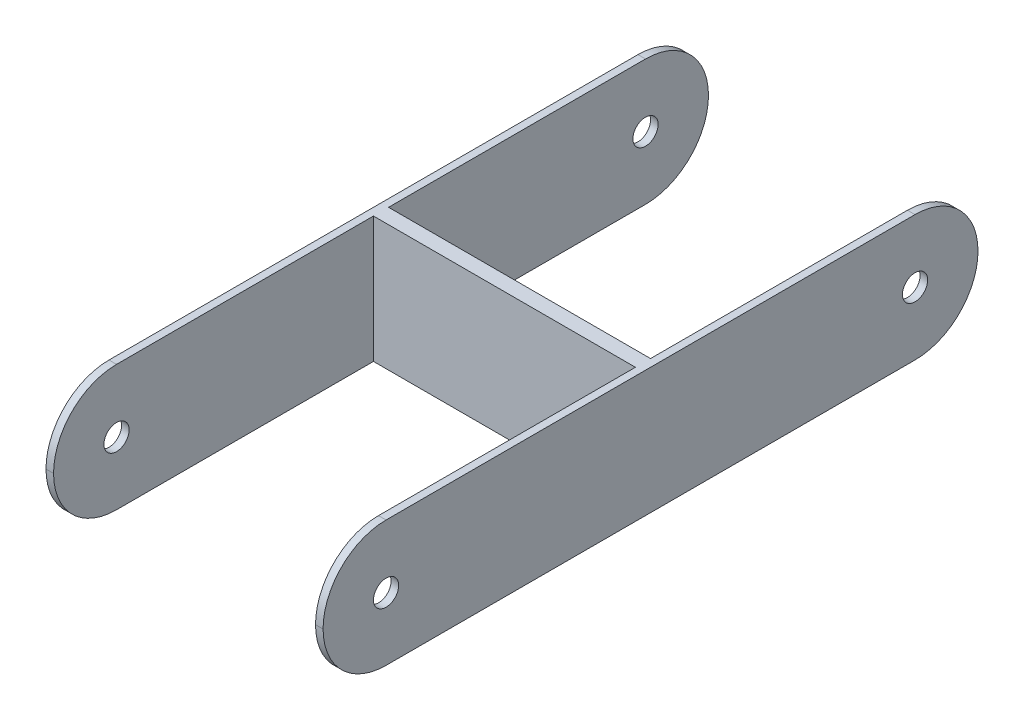
ISO-10303-21;
HEADER;
FILE_DESCRIPTION(('STEP AP214'),'2;1');
FILE_NAME('part.step','',(''),(''),'','','');
FILE_SCHEMA(('AUTOMOTIVE_DESIGN { 1 0 10303 214 1 1 1 1 }'));
ENDSEC;
DATA;
#1=APPLICATION_CONTEXT('core data for automotive mechanical design processes');
#2=APPLICATION_PROTOCOL_DEFINITION('international standard','automotive_design',2000,#1);
#3=PRODUCT_CONTEXT('',#1,'mechanical');
#4=PRODUCT('Part','Part','',(#3));
#5=PRODUCT_RELATED_PRODUCT_CATEGORY('part','',(#4));
#6=PRODUCT_DEFINITION_FORMATION('','',#4);
#7=PRODUCT_DEFINITION_CONTEXT('part definition',#1,'design');
#8=PRODUCT_DEFINITION('design','',#6,#7);
#9=PRODUCT_DEFINITION_SHAPE('','',#8);
#10=(LENGTH_UNIT() NAMED_UNIT(*) SI_UNIT(.MILLI.,.METRE.));
#11=(NAMED_UNIT(*) PLANE_ANGLE_UNIT() SI_UNIT($,.RADIAN.));
#12=(NAMED_UNIT(*) SI_UNIT($,.STERADIAN.) SOLID_ANGLE_UNIT());
#13=UNCERTAINTY_MEASURE_WITH_UNIT(LENGTH_MEASURE(1.E-05),#10,'distance_accuracy_value','');
#14=(GEOMETRIC_REPRESENTATION_CONTEXT(3) GLOBAL_UNCERTAINTY_ASSIGNED_CONTEXT((#13)) GLOBAL_UNIT_ASSIGNED_CONTEXT((#10,
#11,#12)) REPRESENTATION_CONTEXT('',''));
#15=CARTESIAN_POINT('',(0.,0.,0.));
#16=DIRECTION('',(0.,0.,1.));
#17=DIRECTION('',(1.,0.,0.));
#18=AXIS2_PLACEMENT_3D('',#15,#16,#17);
#19=CARTESIAN_POINT('',(-27.5,12.5,32.5));
#20=DIRECTION('',(1.,0.,0.));
#21=DIRECTION('',(0.,0.,-1.));
#22=AXIS2_PLACEMENT_3D('',#19,#20,#21);
#23=PLANE('',#22);
#24=CARTESIAN_POINT('',(-27.5,0.,85.));
#25=DIRECTION('',(-1.,0.,0.));
#26=DIRECTION('',(0.,0.,1.));
#27=AXIS2_PLACEMENT_3D('',#24,#25,#26);
#28=CIRCLE('',#27,2.5);
#29=CARTESIAN_POINT('',(-27.5,0.,87.5));
#30=VERTEX_POINT('',#29);
#31=EDGE_CURVE('E289',#30,#30,#28,.T.);
#32=ORIENTED_EDGE('',*,*,#31,.F.);
#33=EDGE_LOOP('',(#32));
#34=FACE_BOUND('',#33,.T.);
#35=CARTESIAN_POINT('',(-27.5,0.,-20.));
#36=DIRECTION('',(1.,0.,0.));
#37=DIRECTION('',(0.,0.,-1.));
#38=AXIS2_PLACEMENT_3D('',#35,#36,#37);
#39=CIRCLE('',#38,2.5);
#40=CARTESIAN_POINT('',(-27.5,0.,-22.5));
#41=VERTEX_POINT('',#40);
#42=EDGE_CURVE('E187',#41,#41,#39,.T.);
#43=ORIENTED_EDGE('',*,*,#42,.T.);
#44=EDGE_LOOP('',(#43));
#45=FACE_BOUND('',#44,.T.);
#46=DIRECTION('',(0.,0.,1.));
#47=VECTOR('',#46,1.);
#48=CARTESIAN_POINT('',(-27.5,-12.5,32.5));
#49=LINE('',#48,#47);
#50=CARTESIAN_POINT('',(-27.5,-12.5,-20.));
#51=VERTEX_POINT('',#50);
#52=CARTESIAN_POINT('',(-27.5,-12.5,85.));
#53=VERTEX_POINT('',#52);
#54=EDGE_CURVE('E208',#51,#53,#49,.T.);
#55=ORIENTED_EDGE('',*,*,#54,.T.);
#56=CARTESIAN_POINT('',(-27.5,0.,85.));
#57=DIRECTION('',(1.,0.,0.));
#58=DIRECTION('',(0.,0.,-1.));
#59=AXIS2_PLACEMENT_3D('',#56,#57,#58);
#60=CIRCLE('',#59,12.5);
#61=CARTESIAN_POINT('',(-27.5,0.,97.5));
#62=VERTEX_POINT('',#61);
#63=EDGE_CURVE('E266',#53,#62,#60,.F.);
#64=ORIENTED_EDGE('',*,*,#63,.T.);
#65=CARTESIAN_POINT('',(-27.5,0.,85.));
#66=DIRECTION('',(1.,0.,0.));
#67=DIRECTION('',(0.,0.,-1.));
#68=AXIS2_PLACEMENT_3D('',#65,#66,#67);
#69=CIRCLE('',#68,12.5);
#70=CARTESIAN_POINT('',(-27.5,12.5,85.));
#71=VERTEX_POINT('',#70);
#72=EDGE_CURVE('E264',#62,#71,#69,.F.);
#73=ORIENTED_EDGE('',*,*,#72,.T.);
#74=DIRECTION('',(0.,0.,1.));
#75=VECTOR('',#74,1.);
#76=CARTESIAN_POINT('',(-27.5,12.5,32.5));
#77=LINE('',#76,#75);
#78=CARTESIAN_POINT('',(-27.5,12.5,-20.));
#79=VERTEX_POINT('',#78);
#80=EDGE_CURVE('E195',#79,#71,#77,.T.);
#81=ORIENTED_EDGE('',*,*,#80,.F.);
#82=CARTESIAN_POINT('',(-27.5,0.,-20.));
#83=DIRECTION('',(1.,0.,0.));
#84=DIRECTION('',(0.,0.,-1.));
#85=AXIS2_PLACEMENT_3D('',#82,#83,#84);
#86=CIRCLE('',#85,12.5);
#87=CARTESIAN_POINT('',(-27.5,0.,-32.5));
#88=VERTEX_POINT('',#87);
#89=EDGE_CURVE('E225',#79,#88,#86,.F.);
#90=ORIENTED_EDGE('',*,*,#89,.T.);
#91=CARTESIAN_POINT('',(-27.5,0.,-20.));
#92=DIRECTION('',(1.,0.,0.));
#93=DIRECTION('',(0.,0.,-1.));
#94=AXIS2_PLACEMENT_3D('',#91,#92,#93);
#95=CIRCLE('',#94,12.5);
#96=EDGE_CURVE('E227',#88,#51,#95,.F.);
#97=ORIENTED_EDGE('',*,*,#96,.T.);
#98=EDGE_LOOP('',(#55,#64,#73,#81,#90,#97));
#99=FACE_BOUND('',#98,.T.);
#100=ADVANCED_FACE('F33',(#34,#45,#99),#23,.F.);
#101=CARTESIAN_POINT('',(27.5,12.5,32.5));
#102=DIRECTION('',(-1.,0.,0.));
#103=DIRECTION('',(0.,0.,1.));
#104=AXIS2_PLACEMENT_3D('',#101,#102,#103);
#105=PLANE('',#104);
#106=CARTESIAN_POINT('',(27.5,0.,85.));
#107=DIRECTION('',(-1.,0.,0.));
#108=DIRECTION('',(0.,0.,1.));
#109=AXIS2_PLACEMENT_3D('',#106,#107,#108);
#110=CIRCLE('',#109,2.5);
#111=CARTESIAN_POINT('',(27.5,0.,87.5));
#112=VERTEX_POINT('',#111);
#113=EDGE_CURVE('E293',#112,#112,#110,.T.);
#114=ORIENTED_EDGE('',*,*,#113,.T.);
#115=EDGE_LOOP('',(#114));
#116=FACE_BOUND('',#115,.T.);
#117=CARTESIAN_POINT('',(27.5,0.,-20.));
#118=DIRECTION('',(1.,0.,0.));
#119=DIRECTION('',(0.,0.,-1.));
#120=AXIS2_PLACEMENT_3D('',#117,#118,#119);
#121=CIRCLE('',#120,2.5);
#122=CARTESIAN_POINT('',(27.5,0.,-22.5));
#123=VERTEX_POINT('',#122);
#124=EDGE_CURVE('E158',#123,#123,#121,.T.);
#125=ORIENTED_EDGE('',*,*,#124,.F.);
#126=EDGE_LOOP('',(#125));
#127=FACE_BOUND('',#126,.T.);
#128=CARTESIAN_POINT('',(27.5,0.,85.));
#129=DIRECTION('',(-1.,0.,0.));
#130=DIRECTION('',(0.,0.,1.));
#131=AXIS2_PLACEMENT_3D('',#128,#129,#130);
#132=CIRCLE('',#131,12.5);
#133=CARTESIAN_POINT('',(27.5,12.5,85.));
#134=VERTEX_POINT('',#133);
#135=CARTESIAN_POINT('',(27.5,0.,97.5));
#136=VERTEX_POINT('',#135);
#137=EDGE_CURVE('E42',#134,#136,#132,.F.);
#138=ORIENTED_EDGE('',*,*,#137,.T.);
#139=CARTESIAN_POINT('',(27.5,0.,85.));
#140=DIRECTION('',(-1.,0.,0.));
#141=DIRECTION('',(0.,0.,1.));
#142=AXIS2_PLACEMENT_3D('',#139,#140,#141);
#143=CIRCLE('',#142,12.5);
#144=CARTESIAN_POINT('',(27.5,-12.5,85.));
#145=VERTEX_POINT('',#144);
#146=EDGE_CURVE('E11',#136,#145,#143,.F.);
#147=ORIENTED_EDGE('',*,*,#146,.T.);
#148=DIRECTION('',(0.,0.,-1.));
#149=VECTOR('',#148,1.);
#150=CARTESIAN_POINT('',(27.5,-12.5,32.5));
#151=LINE('',#150,#149);
#152=CARTESIAN_POINT('',(27.5,-12.5,-20.));
#153=VERTEX_POINT('',#152);
#154=EDGE_CURVE('E211',#145,#153,#151,.T.);
#155=ORIENTED_EDGE('',*,*,#154,.T.);
#156=CARTESIAN_POINT('',(27.5,0.,-20.));
#157=DIRECTION('',(-1.,0.,0.));
#158=DIRECTION('',(0.,0.,1.));
#159=AXIS2_PLACEMENT_3D('',#156,#157,#158);
#160=CIRCLE('',#159,12.5);
#161=CARTESIAN_POINT('',(27.5,0.,-32.5));
#162=VERTEX_POINT('',#161);
#163=EDGE_CURVE('E250',#153,#162,#160,.F.);
#164=ORIENTED_EDGE('',*,*,#163,.T.);
#165=CARTESIAN_POINT('',(27.5,0.,-20.));
#166=DIRECTION('',(-1.,0.,0.));
#167=DIRECTION('',(0.,0.,1.));
#168=AXIS2_PLACEMENT_3D('',#165,#166,#167);
#169=CIRCLE('',#168,12.5);
#170=CARTESIAN_POINT('',(27.5,12.5,-20.));
#171=VERTEX_POINT('',#170);
#172=EDGE_CURVE('E247',#162,#171,#169,.F.);
#173=ORIENTED_EDGE('',*,*,#172,.T.);
#174=DIRECTION('',(0.,0.,-1.));
#175=VECTOR('',#174,1.);
#176=CARTESIAN_POINT('',(27.5,12.5,32.5));
#177=LINE('',#176,#175);
#178=EDGE_CURVE('E197',#134,#171,#177,.T.);
#179=ORIENTED_EDGE('',*,*,#178,.F.);
#180=EDGE_LOOP('',(#138,#147,#155,#164,#173,#179));
#181=FACE_BOUND('',#180,.T.);
#182=ADVANCED_FACE('F297',(#116,#127,#181),#105,.F.);
#183=CARTESIAN_POINT('',(26.,12.5,31.));
#184=DIRECTION('',(1.,0.,0.));
#185=DIRECTION('',(0.,0.,-1.));
#186=AXIS2_PLACEMENT_3D('',#183,#184,#185);
#187=PLANE('',#186);
#188=CARTESIAN_POINT('',(26.,0.,-20.));
#189=DIRECTION('',(1.,0.,0.));
#190=DIRECTION('',(0.,0.,-1.));
#191=AXIS2_PLACEMENT_3D('',#188,#189,#190);
#192=CIRCLE('',#191,2.5);
#193=CARTESIAN_POINT('',(26.,0.,-22.5));
#194=VERTEX_POINT('',#193);
#195=EDGE_CURVE('E191',#194,#194,#192,.T.);
#196=ORIENTED_EDGE('',*,*,#195,.T.);
#197=EDGE_LOOP('',(#196));
#198=FACE_BOUND('',#197,.T.);
#199=CARTESIAN_POINT('',(26.,0.,-20.));
#200=DIRECTION('',(1.,0.,0.));
#201=DIRECTION('',(0.,0.,-1.));
#202=AXIS2_PLACEMENT_3D('',#199,#200,#201);
#203=CIRCLE('',#202,12.5);
#204=CARTESIAN_POINT('',(26.,12.5,-20.));
#205=VERTEX_POINT('',#204);
#206=CARTESIAN_POINT('',(26.,0.,-32.5));
#207=VERTEX_POINT('',#206);
#208=EDGE_CURVE('E243',#205,#207,#203,.F.);
#209=ORIENTED_EDGE('',*,*,#208,.T.);
#210=CARTESIAN_POINT('',(26.,0.,-20.));
#211=DIRECTION('',(1.,0.,0.));
#212=DIRECTION('',(0.,0.,-1.));
#213=AXIS2_PLACEMENT_3D('',#210,#211,#212);
#214=CIRCLE('',#213,12.5);
#215=CARTESIAN_POINT('',(26.,-12.5,-20.));
#216=VERTEX_POINT('',#215);
#217=EDGE_CURVE('E245',#207,#216,#214,.F.);
#218=ORIENTED_EDGE('',*,*,#217,.T.);
#219=DIRECTION('',(0.,0.,1.));
#220=VECTOR('',#219,1.);
#221=CARTESIAN_POINT('',(26.,-12.5,31.));
#222=LINE('',#221,#220);
#223=CARTESIAN_POINT('',(26.,-12.5,31.));
#224=VERTEX_POINT('',#223);
#225=EDGE_CURVE('E214',#216,#224,#222,.T.);
#226=ORIENTED_EDGE('',*,*,#225,.T.);
#227=DIRECTION('',(0.,-1.,0.));
#228=VECTOR('',#227,1.);
#229=CARTESIAN_POINT('',(26.,12.5,31.));
#230=LINE('',#229,#228);
#231=CARTESIAN_POINT('',(26.,12.5,31.));
#232=VERTEX_POINT('',#231);
#233=EDGE_CURVE('E222',#232,#224,#230,.T.);
#234=ORIENTED_EDGE('',*,*,#233,.F.);
#235=DIRECTION('',(0.,0.,1.));
#236=VECTOR('',#235,1.);
#237=CARTESIAN_POINT('',(26.,12.5,31.));
#238=LINE('',#237,#236);
#239=EDGE_CURVE('E200',#205,#232,#238,.T.);
#240=ORIENTED_EDGE('',*,*,#239,.F.);
#241=EDGE_LOOP('',(#209,#218,#226,#234,#240));
#242=FACE_BOUND('',#241,.T.);
#243=ADVANCED_FACE('F320',(#198,#242),#187,.F.);
#244=CARTESIAN_POINT('',(26.,12.5,31.));
#245=DIRECTION('',(0.,0.,1.));
#246=DIRECTION('',(1.,0.,0.));
#247=AXIS2_PLACEMENT_3D('',#244,#245,#246);
#248=PLANE('',#247);
#249=DIRECTION('',(-1.,0.,0.));
#250=VECTOR('',#249,1.);
#251=CARTESIAN_POINT('',(26.,-12.5,31.));
#252=LINE('',#251,#250);
#253=CARTESIAN_POINT('',(-26.,-12.5,31.));
#254=VERTEX_POINT('',#253);
#255=EDGE_CURVE('E216',#224,#254,#252,.T.);
#256=ORIENTED_EDGE('',*,*,#255,.T.);
#257=DIRECTION('',(0.,-1.,0.));
#258=VECTOR('',#257,1.);
#259=CARTESIAN_POINT('',(-26.,12.5,31.));
#260=LINE('',#259,#258);
#261=CARTESIAN_POINT('',(-26.,12.5,31.));
#262=VERTEX_POINT('',#261);
#263=EDGE_CURVE('E207',#262,#254,#260,.T.);
#264=ORIENTED_EDGE('',*,*,#263,.F.);
#265=DIRECTION('',(-1.,0.,0.));
#266=VECTOR('',#265,1.);
#267=CARTESIAN_POINT('',(26.,12.5,31.));
#268=LINE('',#267,#266);
#269=EDGE_CURVE('E202',#232,#262,#268,.T.);
#270=ORIENTED_EDGE('',*,*,#269,.F.);
#271=ORIENTED_EDGE('',*,*,#233,.T.);
#272=EDGE_LOOP('',(#256,#264,#270,#271));
#273=FACE_BOUND('',#272,.T.);
#274=ADVANCED_FACE('F381',(#273),#248,.F.);
#275=CARTESIAN_POINT('',(-26.,12.5,31.));
#276=DIRECTION('',(-1.,0.,0.));
#277=DIRECTION('',(0.,0.,1.));
#278=AXIS2_PLACEMENT_3D('',#275,#276,#277);
#279=PLANE('',#278);
#280=CARTESIAN_POINT('',(-26.,0.,-20.));
#281=DIRECTION('',(-1.,0.,0.));
#282=DIRECTION('',(0.,0.,1.));
#283=AXIS2_PLACEMENT_3D('',#280,#281,#282);
#284=CIRCLE('',#283,2.5);
#285=CARTESIAN_POINT('',(-26.,0.,-17.5));
#286=VERTEX_POINT('',#285);
#287=EDGE_CURVE('E190',#286,#286,#284,.T.);
#288=ORIENTED_EDGE('',*,*,#287,.T.);
#289=EDGE_LOOP('',(#288));
#290=FACE_BOUND('',#289,.T.);
#291=DIRECTION('',(0.,0.,-1.));
#292=VECTOR('',#291,1.);
#293=CARTESIAN_POINT('',(-26.,-12.5,31.));
#294=LINE('',#293,#292);
#295=CARTESIAN_POINT('',(-26.,-12.5,-20.));
#296=VERTEX_POINT('',#295);
#297=EDGE_CURVE('E198',#254,#296,#294,.T.);
#298=ORIENTED_EDGE('',*,*,#297,.T.);
#299=CARTESIAN_POINT('',(-26.,0.,-20.));
#300=DIRECTION('',(-1.,0.,0.));
#301=DIRECTION('',(0.,0.,1.));
#302=AXIS2_PLACEMENT_3D('',#299,#300,#301);
#303=CIRCLE('',#302,12.5);
#304=CARTESIAN_POINT('',(-26.,0.,-32.5));
#305=VERTEX_POINT('',#304);
#306=EDGE_CURVE('E237',#296,#305,#303,.F.);
#307=ORIENTED_EDGE('',*,*,#306,.T.);
#308=CARTESIAN_POINT('',(-26.,0.,-20.));
#309=DIRECTION('',(-1.,0.,0.));
#310=DIRECTION('',(0.,0.,1.));
#311=AXIS2_PLACEMENT_3D('',#308,#309,#310);
#312=CIRCLE('',#311,12.5);
#313=CARTESIAN_POINT('',(-26.,12.5,-20.));
#314=VERTEX_POINT('',#313);
#315=EDGE_CURVE('E235',#305,#314,#312,.F.);
#316=ORIENTED_EDGE('',*,*,#315,.T.);
#317=DIRECTION('',(0.,0.,-1.));
#318=VECTOR('',#317,1.);
#319=CARTESIAN_POINT('',(-26.,12.5,31.));
#320=LINE('',#319,#318);
#321=EDGE_CURVE('E204',#262,#314,#320,.T.);
#322=ORIENTED_EDGE('',*,*,#321,.F.);
#323=ORIENTED_EDGE('',*,*,#263,.T.);
#324=EDGE_LOOP('',(#298,#307,#316,#322,#323));
#325=FACE_BOUND('',#324,.T.);
#326=ADVANCED_FACE('F393',(#290,#325),#279,.F.);
#327=CARTESIAN_POINT('',(0.,12.5,0.));
#328=DIRECTION('',(0.,1.,0.));
#329=DIRECTION('',(0.,0.,1.));
#330=AXIS2_PLACEMENT_3D('',#327,#328,#329);
#331=PLANE('',#330);
#332=ORIENTED_EDGE('',*,*,#80,.T.);
#333=DIRECTION('',(-1.,0.,0.));
#334=VECTOR('',#333,1.);
#335=CARTESIAN_POINT('',(0.,12.5,85.));
#336=LINE('',#335,#334);
#337=CARTESIAN_POINT('',(-26.,12.5,85.));
#338=VERTEX_POINT('',#337);
#339=EDGE_CURVE('E168',#71,#338,#336,.F.);
#340=ORIENTED_EDGE('',*,*,#339,.T.);
#341=DIRECTION('',(0.,0.,1.));
#342=VECTOR('',#341,1.);
#343=CARTESIAN_POINT('',(-26.,12.5,34.));
#344=LINE('',#343,#342);
#345=CARTESIAN_POINT('',(-26.,12.5,34.));
#346=VERTEX_POINT('',#345);
#347=EDGE_CURVE('E150',#346,#338,#344,.T.);
#348=ORIENTED_EDGE('',*,*,#347,.F.);
#349=DIRECTION('',(-1.,0.,0.));
#350=VECTOR('',#349,1.);
#351=CARTESIAN_POINT('',(26.,12.5,34.));
#352=LINE('',#351,#350);
#353=CARTESIAN_POINT('',(26.,12.5,34.));
#354=VERTEX_POINT('',#353);
#355=EDGE_CURVE('E166',#354,#346,#352,.T.);
#356=ORIENTED_EDGE('',*,*,#355,.F.);
#357=DIRECTION('',(0.,0.,-1.));
#358=VECTOR('',#357,1.);
#359=CARTESIAN_POINT('',(26.,12.5,34.));
#360=LINE('',#359,#358);
#361=CARTESIAN_POINT('',(26.,12.5,85.));
#362=VERTEX_POINT('',#361);
#363=EDGE_CURVE('E174',#362,#354,#360,.T.);
#364=ORIENTED_EDGE('',*,*,#363,.F.);
#365=DIRECTION('',(-1.,0.,0.));
#366=VECTOR('',#365,1.);
#367=CARTESIAN_POINT('',(0.,12.5,85.));
#368=LINE('',#367,#366);
#369=EDGE_CURVE('E272',#362,#134,#368,.F.);
#370=ORIENTED_EDGE('',*,*,#369,.T.);
#371=ORIENTED_EDGE('',*,*,#178,.T.);
#372=DIRECTION('',(-1.,0.,0.));
#373=VECTOR('',#372,1.);
#374=CARTESIAN_POINT('',(26.,12.5,-20.));
#375=LINE('',#374,#373);
#376=EDGE_CURVE('E239',#171,#205,#375,.T.);
#377=ORIENTED_EDGE('',*,*,#376,.T.);
#378=ORIENTED_EDGE('',*,*,#239,.T.);
#379=ORIENTED_EDGE('',*,*,#269,.T.);
#380=ORIENTED_EDGE('',*,*,#321,.T.);
#381=DIRECTION('',(-1.,0.,0.));
#382=VECTOR('',#381,1.);
#383=CARTESIAN_POINT('',(-27.5,12.5,-20.));
#384=LINE('',#383,#382);
#385=EDGE_CURVE('E241',#314,#79,#384,.T.);
#386=ORIENTED_EDGE('',*,*,#385,.T.);
#387=EDGE_LOOP('',(#332,#340,#348,#356,#364,#370,#371,#377,#378,#379,#380,#386));
#388=FACE_BOUND('',#387,.T.);
#389=ADVANCED_FACE('F164',(#388),#331,.T.);
#390=CARTESIAN_POINT('',(0.,-12.5,0.));
#391=DIRECTION('',(0.,1.,0.));
#392=DIRECTION('',(0.,0.,1.));
#393=AXIS2_PLACEMENT_3D('',#390,#391,#392);
#394=PLANE('',#393);
#395=DIRECTION('',(0.,0.,1.));
#396=VECTOR('',#395,1.);
#397=CARTESIAN_POINT('',(-26.,-12.5,34.));
#398=LINE('',#397,#396);
#399=CARTESIAN_POINT('',(-26.,-12.5,34.));
#400=VERTEX_POINT('',#399);
#401=CARTESIAN_POINT('',(-26.,-12.5,85.));
#402=VERTEX_POINT('',#401);
#403=EDGE_CURVE('E153',#400,#402,#398,.T.);
#404=ORIENTED_EDGE('',*,*,#403,.T.);
#405=DIRECTION('',(-1.,0.,0.));
#406=VECTOR('',#405,1.);
#407=CARTESIAN_POINT('',(-27.5,-12.5,85.));
#408=LINE('',#407,#406);
#409=EDGE_CURVE('E261',#402,#53,#408,.T.);
#410=ORIENTED_EDGE('',*,*,#409,.T.);
#411=ORIENTED_EDGE('',*,*,#54,.F.);
#412=DIRECTION('',(-1.,0.,0.));
#413=VECTOR('',#412,1.);
#414=CARTESIAN_POINT('',(0.,-12.5,-20.));
#415=LINE('',#414,#413);
#416=EDGE_CURVE('E232',#51,#296,#415,.F.);
#417=ORIENTED_EDGE('',*,*,#416,.T.);
#418=ORIENTED_EDGE('',*,*,#297,.F.);
#419=ORIENTED_EDGE('',*,*,#255,.F.);
#420=ORIENTED_EDGE('',*,*,#225,.F.);
#421=DIRECTION('',(-1.,0.,0.));
#422=VECTOR('',#421,1.);
#423=CARTESIAN_POINT('',(0.,-12.5,-20.));
#424=LINE('',#423,#422);
#425=EDGE_CURVE('E229',#216,#153,#424,.F.);
#426=ORIENTED_EDGE('',*,*,#425,.T.);
#427=ORIENTED_EDGE('',*,*,#154,.F.);
#428=DIRECTION('',(-1.,0.,0.));
#429=VECTOR('',#428,1.);
#430=CARTESIAN_POINT('',(26.,-12.5,85.));
#431=LINE('',#430,#429);
#432=CARTESIAN_POINT('',(26.,-12.5,85.));
#433=VERTEX_POINT('',#432);
#434=EDGE_CURVE('E252',#145,#433,#431,.T.);
#435=ORIENTED_EDGE('',*,*,#434,.T.);
#436=DIRECTION('',(0.,0.,-1.));
#437=VECTOR('',#436,1.);
#438=CARTESIAN_POINT('',(26.,-12.5,34.));
#439=LINE('',#438,#437);
#440=CARTESIAN_POINT('',(26.,-12.5,34.));
#441=VERTEX_POINT('',#440);
#442=EDGE_CURVE('E169',#433,#441,#439,.T.);
#443=ORIENTED_EDGE('',*,*,#442,.T.);
#444=DIRECTION('',(-1.,0.,0.));
#445=VECTOR('',#444,1.);
#446=CARTESIAN_POINT('',(26.,-12.5,34.));
#447=LINE('',#446,#445);
#448=EDGE_CURVE('E180',#441,#400,#447,.T.);
#449=ORIENTED_EDGE('',*,*,#448,.T.);
#450=EDGE_LOOP('',(#404,#410,#411,#417,#418,#419,#420,#426,#427,#435,#443,#449));
#451=FACE_BOUND('',#450,.T.);
#452=ADVANCED_FACE('F334',(#451),#394,.F.);
#453=CARTESIAN_POINT('',(0.,0.,-20.));
#454=DIRECTION('',(1.,0.,0.));
#455=DIRECTION('',(0.,0.,-1.));
#456=AXIS2_PLACEMENT_3D('',#453,#454,#455);
#457=CYLINDRICAL_SURFACE('',#456,12.5);
#458=ORIENTED_EDGE('',*,*,#385,.F.);
#459=ORIENTED_EDGE('',*,*,#315,.F.);
#460=DIRECTION('',(-1.,0.,0.));
#461=VECTOR('',#460,1.);
#462=CARTESIAN_POINT('',(-26.,0.,-32.5));
#463=LINE('',#462,#461);
#464=EDGE_CURVE('E212',#88,#305,#463,.F.);
#465=ORIENTED_EDGE('',*,*,#464,.F.);
#466=ORIENTED_EDGE('',*,*,#89,.F.);
#467=EDGE_LOOP('',(#458,#459,#465,#466));
#468=FACE_BOUND('',#467,.T.);
#469=ADVANCED_FACE('F330',(#468),#457,.T.);
#470=CARTESIAN_POINT('',(-27.5,0.,-20.));
#471=DIRECTION('',(-1.,0.,0.));
#472=DIRECTION('',(0.,0.,1.));
#473=AXIS2_PLACEMENT_3D('',#470,#471,#472);
#474=CYLINDRICAL_SURFACE('',#473,12.5);
#475=ORIENTED_EDGE('',*,*,#306,.F.);
#476=ORIENTED_EDGE('',*,*,#416,.F.);
#477=ORIENTED_EDGE('',*,*,#96,.F.);
#478=ORIENTED_EDGE('',*,*,#464,.T.);
#479=EDGE_LOOP('',(#475,#476,#477,#478));
#480=FACE_BOUND('',#479,.T.);
#481=ADVANCED_FACE('F326',(#480),#474,.T.);
#482=CARTESIAN_POINT('',(0.,0.,-20.));
#483=DIRECTION('',(1.,0.,0.));
#484=DIRECTION('',(0.,0.,-1.));
#485=AXIS2_PLACEMENT_3D('',#482,#483,#484);
#486=CYLINDRICAL_SURFACE('',#485,12.5);
#487=ORIENTED_EDGE('',*,*,#376,.F.);
#488=ORIENTED_EDGE('',*,*,#172,.F.);
#489=DIRECTION('',(-1.,0.,0.));
#490=VECTOR('',#489,1.);
#491=CARTESIAN_POINT('',(27.5,0.,-32.5));
#492=LINE('',#491,#490);
#493=EDGE_CURVE('E194',#207,#162,#492,.F.);
#494=ORIENTED_EDGE('',*,*,#493,.F.);
#495=ORIENTED_EDGE('',*,*,#208,.F.);
#496=EDGE_LOOP('',(#487,#488,#494,#495));
#497=FACE_BOUND('',#496,.T.);
#498=ADVANCED_FACE('F329',(#497),#486,.T.);
#499=CARTESIAN_POINT('',(26.,0.,-20.));
#500=DIRECTION('',(-1.,0.,0.));
#501=DIRECTION('',(0.,0.,1.));
#502=AXIS2_PLACEMENT_3D('',#499,#500,#501);
#503=CYLINDRICAL_SURFACE('',#502,12.5);
#504=ORIENTED_EDGE('',*,*,#163,.F.);
#505=ORIENTED_EDGE('',*,*,#425,.F.);
#506=ORIENTED_EDGE('',*,*,#217,.F.);
#507=ORIENTED_EDGE('',*,*,#493,.T.);
#508=EDGE_LOOP('',(#504,#505,#506,#507));
#509=FACE_BOUND('',#508,.T.);
#510=ADVANCED_FACE('F336',(#509),#503,.T.);
#511=CARTESIAN_POINT('',(-27.5,0.,-20.));
#512=DIRECTION('',(1.,0.,0.));
#513=DIRECTION('',(0.,0.,-1.));
#514=AXIS2_PLACEMENT_3D('',#511,#512,#513);
#515=CYLINDRICAL_SURFACE('',#514,2.5);
#516=ORIENTED_EDGE('',*,*,#42,.F.);
#517=EDGE_LOOP('',(#516));
#518=FACE_BOUND('',#517,.T.);
#519=ORIENTED_EDGE('',*,*,#287,.F.);
#520=EDGE_LOOP('',(#519));
#521=FACE_BOUND('',#520,.T.);
#522=ADVANCED_FACE('F339',(#518,#521),#515,.F.);
#523=ORIENTED_EDGE('',*,*,#124,.T.);
#524=EDGE_LOOP('',(#523));
#525=FACE_BOUND('',#524,.T.);
#526=ORIENTED_EDGE('',*,*,#195,.F.);
#527=EDGE_LOOP('',(#526));
#528=FACE_BOUND('',#527,.T.);
#529=ADVANCED_FACE('F410',(#525,#528),#515,.F.);
#530=CARTESIAN_POINT('',(-26.,12.5,34.));
#531=DIRECTION('',(1.,0.,0.));
#532=DIRECTION('',(0.,0.,-1.));
#533=AXIS2_PLACEMENT_3D('',#530,#531,#532);
#534=PLANE('',#533);
#535=CARTESIAN_POINT('',(-26.,0.,85.));
#536=DIRECTION('',(1.,0.,0.));
#537=DIRECTION('',(0.,0.,-1.));
#538=AXIS2_PLACEMENT_3D('',#535,#536,#537);
#539=CIRCLE('',#538,2.5);
#540=CARTESIAN_POINT('',(-26.,0.,82.5));
#541=VERTEX_POINT('',#540);
#542=EDGE_CURVE('E282',#541,#541,#539,.F.);
#543=ORIENTED_EDGE('',*,*,#542,.T.);
#544=EDGE_LOOP('',(#543));
#545=FACE_BOUND('',#544,.T.);
#546=CARTESIAN_POINT('',(-26.,0.,85.));
#547=DIRECTION('',(1.,0.,0.));
#548=DIRECTION('',(0.,0.,-1.));
#549=AXIS2_PLACEMENT_3D('',#546,#547,#548);
#550=CIRCLE('',#549,12.5);
#551=CARTESIAN_POINT('',(-26.,0.,97.5));
#552=VERTEX_POINT('',#551);
#553=EDGE_CURVE('E268',#338,#552,#550,.T.);
#554=ORIENTED_EDGE('',*,*,#553,.T.);
#555=CARTESIAN_POINT('',(-26.,0.,85.));
#556=DIRECTION('',(1.,0.,0.));
#557=DIRECTION('',(0.,0.,-1.));
#558=AXIS2_PLACEMENT_3D('',#555,#556,#557);
#559=CIRCLE('',#558,12.5);
#560=EDGE_CURVE('E270',#552,#402,#559,.T.);
#561=ORIENTED_EDGE('',*,*,#560,.T.);
#562=ORIENTED_EDGE('',*,*,#403,.F.);
#563=DIRECTION('',(0.,-1.,0.));
#564=VECTOR('',#563,1.);
#565=CARTESIAN_POINT('',(-26.,12.5,34.));
#566=LINE('',#565,#564);
#567=EDGE_CURVE('E147',#346,#400,#566,.T.);
#568=ORIENTED_EDGE('',*,*,#567,.F.);
#569=ORIENTED_EDGE('',*,*,#347,.T.);
#570=EDGE_LOOP('',(#554,#561,#562,#568,#569));
#571=FACE_BOUND('',#570,.T.);
#572=ADVANCED_FACE('F149',(#545,#571),#534,.T.);
#573=CARTESIAN_POINT('',(26.,12.5,34.));
#574=DIRECTION('',(0.,0.,1.));
#575=DIRECTION('',(1.,0.,0.));
#576=AXIS2_PLACEMENT_3D('',#573,#574,#575);
#577=PLANE('',#576);
#578=ORIENTED_EDGE('',*,*,#448,.F.);
#579=DIRECTION('',(0.,-1.,0.));
#580=VECTOR('',#579,1.);
#581=CARTESIAN_POINT('',(26.,12.5,34.));
#582=LINE('',#581,#580);
#583=EDGE_CURVE('E159',#354,#441,#582,.T.);
#584=ORIENTED_EDGE('',*,*,#583,.F.);
#585=ORIENTED_EDGE('',*,*,#355,.T.);
#586=ORIENTED_EDGE('',*,*,#567,.T.);
#587=EDGE_LOOP('',(#578,#584,#585,#586));
#588=FACE_BOUND('',#587,.T.);
#589=ADVANCED_FACE('F172',(#588),#577,.T.);
#590=CARTESIAN_POINT('',(26.,12.5,34.));
#591=DIRECTION('',(-1.,0.,0.));
#592=DIRECTION('',(0.,0.,1.));
#593=AXIS2_PLACEMENT_3D('',#590,#591,#592);
#594=PLANE('',#593);
#595=CARTESIAN_POINT('',(26.,0.,85.));
#596=DIRECTION('',(-1.,0.,0.));
#597=DIRECTION('',(0.,0.,1.));
#598=AXIS2_PLACEMENT_3D('',#595,#596,#597);
#599=CIRCLE('',#598,2.5);
#600=CARTESIAN_POINT('',(26.,0.,87.5));
#601=VERTEX_POINT('',#600);
#602=EDGE_CURVE('E37',#601,#601,#599,.F.);
#603=ORIENTED_EDGE('',*,*,#602,.T.);
#604=EDGE_LOOP('',(#603));
#605=FACE_BOUND('',#604,.T.);
#606=ORIENTED_EDGE('',*,*,#442,.F.);
#607=CARTESIAN_POINT('',(26.,0.,85.));
#608=DIRECTION('',(-1.,0.,0.));
#609=DIRECTION('',(0.,0.,1.));
#610=AXIS2_PLACEMENT_3D('',#607,#608,#609);
#611=CIRCLE('',#610,12.5);
#612=CARTESIAN_POINT('',(26.,0.,97.5));
#613=VERTEX_POINT('',#612);
#614=EDGE_CURVE('E56',#433,#613,#611,.T.);
#615=ORIENTED_EDGE('',*,*,#614,.T.);
#616=CARTESIAN_POINT('',(26.,0.,85.));
#617=DIRECTION('',(-1.,0.,0.));
#618=DIRECTION('',(0.,0.,1.));
#619=AXIS2_PLACEMENT_3D('',#616,#617,#618);
#620=CIRCLE('',#619,12.5);
#621=EDGE_CURVE('E275',#613,#362,#620,.T.);
#622=ORIENTED_EDGE('',*,*,#621,.T.);
#623=ORIENTED_EDGE('',*,*,#363,.T.);
#624=ORIENTED_EDGE('',*,*,#583,.T.);
#625=EDGE_LOOP('',(#606,#615,#622,#623,#624));
#626=FACE_BOUND('',#625,.T.);
#627=ADVANCED_FACE('F350',(#605,#626),#594,.T.);
#628=CARTESIAN_POINT('',(-27.5,0.,85.));
#629=DIRECTION('',(-1.,0.,0.));
#630=DIRECTION('',(0.,0.,1.));
#631=AXIS2_PLACEMENT_3D('',#628,#629,#630);
#632=CYLINDRICAL_SURFACE('',#631,12.5);
#633=DIRECTION('',(-1.,0.,0.));
#634=VECTOR('',#633,1.);
#635=CARTESIAN_POINT('',(-27.5,0.,97.5));
#636=LINE('',#635,#634);
#637=EDGE_CURVE('E181',#552,#62,#636,.T.);
#638=ORIENTED_EDGE('',*,*,#637,.F.);
#639=ORIENTED_EDGE('',*,*,#553,.F.);
#640=ORIENTED_EDGE('',*,*,#339,.F.);
#641=ORIENTED_EDGE('',*,*,#72,.F.);
#642=EDGE_LOOP('',(#638,#639,#640,#641));
#643=FACE_BOUND('',#642,.T.);
#644=ADVANCED_FACE('F347',(#643),#632,.T.);
#645=CARTESIAN_POINT('',(0.,0.,85.));
#646=DIRECTION('',(1.,0.,0.));
#647=DIRECTION('',(0.,0.,-1.));
#648=AXIS2_PLACEMENT_3D('',#645,#646,#647);
#649=CYLINDRICAL_SURFACE('',#648,12.5);
#650=ORIENTED_EDGE('',*,*,#560,.F.);
#651=ORIENTED_EDGE('',*,*,#637,.T.);
#652=ORIENTED_EDGE('',*,*,#63,.F.);
#653=ORIENTED_EDGE('',*,*,#409,.F.);
#654=EDGE_LOOP('',(#650,#651,#652,#653));
#655=FACE_BOUND('',#654,.T.);
#656=ADVANCED_FACE('F344',(#655),#649,.T.);
#657=CARTESIAN_POINT('',(26.,0.,85.));
#658=DIRECTION('',(-1.,0.,0.));
#659=DIRECTION('',(0.,0.,1.));
#660=AXIS2_PLACEMENT_3D('',#657,#658,#659);
#661=CYLINDRICAL_SURFACE('',#660,12.5);
#662=DIRECTION('',(-1.,0.,0.));
#663=VECTOR('',#662,1.);
#664=CARTESIAN_POINT('',(26.,0.,97.5));
#665=LINE('',#664,#663);
#666=EDGE_CURVE('E280',#136,#613,#665,.T.);
#667=ORIENTED_EDGE('',*,*,#666,.F.);
#668=ORIENTED_EDGE('',*,*,#137,.F.);
#669=ORIENTED_EDGE('',*,*,#369,.F.);
#670=ORIENTED_EDGE('',*,*,#621,.F.);
#671=EDGE_LOOP('',(#667,#668,#669,#670));
#672=FACE_BOUND('',#671,.T.);
#673=ADVANCED_FACE('F35',(#672),#661,.T.);
#674=CARTESIAN_POINT('',(0.,0.,85.));
#675=DIRECTION('',(1.,0.,0.));
#676=DIRECTION('',(0.,0.,-1.));
#677=AXIS2_PLACEMENT_3D('',#674,#675,#676);
#678=CYLINDRICAL_SURFACE('',#677,12.5);
#679=ORIENTED_EDGE('',*,*,#146,.F.);
#680=ORIENTED_EDGE('',*,*,#666,.T.);
#681=ORIENTED_EDGE('',*,*,#614,.F.);
#682=ORIENTED_EDGE('',*,*,#434,.F.);
#683=EDGE_LOOP('',(#679,#680,#681,#682));
#684=FACE_BOUND('',#683,.T.);
#685=ADVANCED_FACE('F303',(#684),#678,.T.);
#686=CARTESIAN_POINT('',(-27.5,0.,85.));
#687=DIRECTION('',(1.,0.,0.));
#688=DIRECTION('',(0.,0.,-1.));
#689=AXIS2_PLACEMENT_3D('',#686,#687,#688);
#690=CYLINDRICAL_SURFACE('',#689,2.5);
#691=ORIENTED_EDGE('',*,*,#602,.F.);
#692=EDGE_LOOP('',(#691));
#693=FACE_BOUND('',#692,.T.);
#694=ORIENTED_EDGE('',*,*,#113,.F.);
#695=EDGE_LOOP('',(#694));
#696=FACE_BOUND('',#695,.T.);
#697=ADVANCED_FACE('F300',(#693,#696),#690,.F.);
#698=ORIENTED_EDGE('',*,*,#542,.F.);
#699=EDGE_LOOP('',(#698));
#700=FACE_BOUND('',#699,.T.);
#701=ORIENTED_EDGE('',*,*,#31,.T.);
#702=EDGE_LOOP('',(#701));
#703=FACE_BOUND('',#702,.T.);
#704=ADVANCED_FACE('F302',(#700,#703),#690,.F.);
#705=CLOSED_SHELL('',(#100,#182,#243,#274,#326,#389,#452,#469,#481,#498,#510,#522,#529,#572,
#589,#627,#644,#656,#673,#685,#697,#704));
#706=MANIFOLD_SOLID_BREP('B2',#705);
#707=ADVANCED_BREP_SHAPE_REPRESENTATION('',(#18,#706),#14);
#708=SHAPE_DEFINITION_REPRESENTATION(#9,#707);
ENDSEC;
END-ISO-10303-21;
